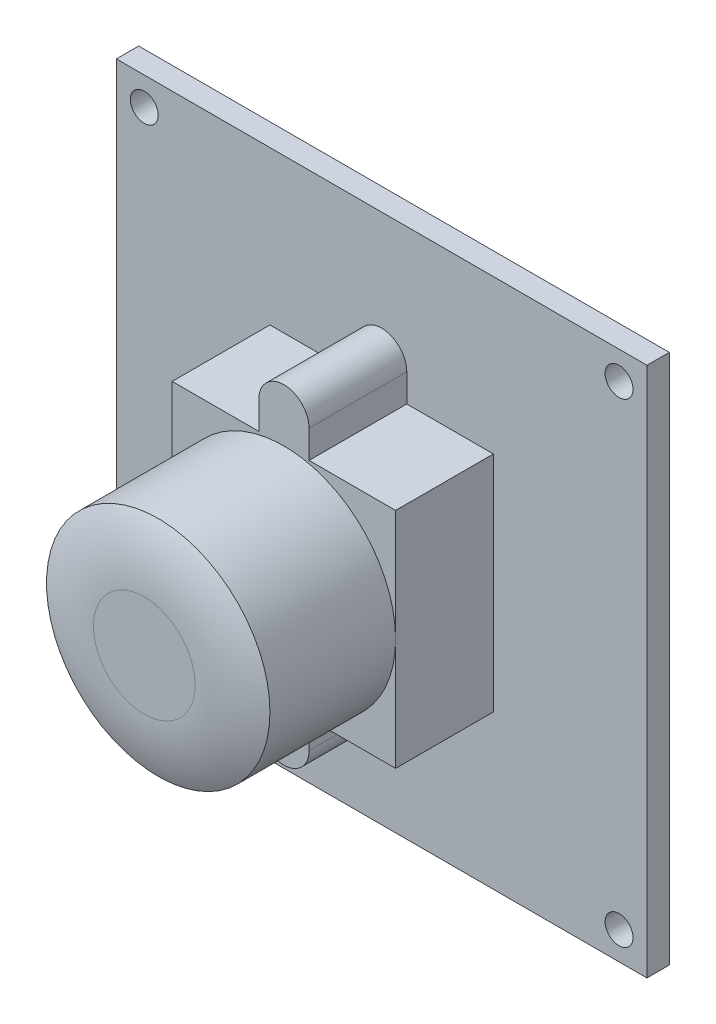
ISO-10303-21;
HEADER;
FILE_DESCRIPTION(('STEP AP214'),'2;1');
FILE_NAME('part.step','',(''),(''),'','','');
FILE_SCHEMA(('AUTOMOTIVE_DESIGN { 1 0 10303 214 1 1 1 1 }'));
ENDSEC;
DATA;
#1=APPLICATION_CONTEXT('core data for automotive mechanical design processes');
#2=APPLICATION_PROTOCOL_DEFINITION('international standard','automotive_design',2000,#1);
#3=PRODUCT_CONTEXT('',#1,'mechanical');
#4=PRODUCT('Part','Part','',(#3));
#5=PRODUCT_RELATED_PRODUCT_CATEGORY('part','',(#4));
#6=PRODUCT_DEFINITION_FORMATION('','',#4);
#7=PRODUCT_DEFINITION_CONTEXT('part definition',#1,'design');
#8=PRODUCT_DEFINITION('design','',#6,#7);
#9=PRODUCT_DEFINITION_SHAPE('','',#8);
#10=(LENGTH_UNIT() NAMED_UNIT(*) SI_UNIT(.MILLI.,.METRE.));
#11=(NAMED_UNIT(*) PLANE_ANGLE_UNIT() SI_UNIT($,.RADIAN.));
#12=(NAMED_UNIT(*) SI_UNIT($,.STERADIAN.) SOLID_ANGLE_UNIT());
#13=UNCERTAINTY_MEASURE_WITH_UNIT(LENGTH_MEASURE(1.E-05),#10,'distance_accuracy_value','');
#14=(GEOMETRIC_REPRESENTATION_CONTEXT(3) GLOBAL_UNCERTAINTY_ASSIGNED_CONTEXT((#13)) GLOBAL_UNIT_ASSIGNED_CONTEXT((#10,
#11,#12)) REPRESENTATION_CONTEXT('',''));
#15=CARTESIAN_POINT('',(0.,0.,0.));
#16=DIRECTION('',(0.,0.,1.));
#17=DIRECTION('',(1.,0.,0.));
#18=AXIS2_PLACEMENT_3D('',#15,#16,#17);
#19=CARTESIAN_POINT('',(19.,9.,8.6));
#20=DIRECTION('',(0.,0.,1.));
#21=DIRECTION('',(1.,0.,0.));
#22=AXIS2_PLACEMENT_3D('',#19,#20,#21);
#23=PLANE('',#22);
#24=CARTESIAN_POINT('',(19.,19.,8.6));
#25=DIRECTION('',(0.,0.,1.));
#26=DIRECTION('',(1.,0.,0.));
#27=AXIS2_PLACEMENT_3D('',#24,#25,#26);
#28=CIRCLE('',#27,8.);
#29=CARTESIAN_POINT('',(27.,19.,8.6));
#30=VERTEX_POINT('',#29);
#31=CARTESIAN_POINT('',(11.,19.,8.6));
#32=VERTEX_POINT('',#31);
#33=EDGE_CURVE('E199',#30,#32,#28,.T.);
#34=ORIENTED_EDGE('',*,*,#33,.F.);
#35=DIRECTION('',(0.,1.,0.));
#36=VECTOR('',#35,1.);
#37=CARTESIAN_POINT('',(27.,27.,8.6));
#38=LINE('',#37,#36);
#39=CARTESIAN_POINT('',(27.,27.,8.6));
#40=VERTEX_POINT('',#39);
#41=EDGE_CURVE('E223',#30,#40,#38,.T.);
#42=ORIENTED_EDGE('',*,*,#41,.T.);
#43=DIRECTION('',(-1.,0.,0.));
#44=VECTOR('',#43,1.);
#45=CARTESIAN_POINT('',(20.8,27.,8.6));
#46=LINE('',#45,#44);
#47=CARTESIAN_POINT('',(20.8,27.,8.6));
#48=VERTEX_POINT('',#47);
#49=EDGE_CURVE('E226',#40,#48,#46,.T.);
#50=ORIENTED_EDGE('',*,*,#49,.T.);
#51=DIRECTION('',(0.,1.,0.));
#52=VECTOR('',#51,1.);
#53=CARTESIAN_POINT('',(20.8,29.,8.6));
#54=LINE('',#53,#52);
#55=CARTESIAN_POINT('',(20.8,29.,8.6));
#56=VERTEX_POINT('',#55);
#57=EDGE_CURVE('E228',#48,#56,#54,.T.);
#58=ORIENTED_EDGE('',*,*,#57,.T.);
#59=CARTESIAN_POINT('',(19.,29.,8.6));
#60=DIRECTION('',(0.,0.,1.));
#61=DIRECTION('',(-1.,0.,0.));
#62=AXIS2_PLACEMENT_3D('',#59,#60,#61);
#63=CIRCLE('',#62,1.79999999999999);
#64=CARTESIAN_POINT('',(17.2,29.,8.6));
#65=VERTEX_POINT('',#64);
#66=EDGE_CURVE('E230',#56,#65,#63,.T.);
#67=ORIENTED_EDGE('',*,*,#66,.T.);
#68=DIRECTION('',(0.,-1.,0.));
#69=VECTOR('',#68,1.);
#70=CARTESIAN_POINT('',(17.2,27.,8.6));
#71=LINE('',#70,#69);
#72=CARTESIAN_POINT('',(17.2,27.,8.6));
#73=VERTEX_POINT('',#72);
#74=EDGE_CURVE('E232',#65,#73,#71,.T.);
#75=ORIENTED_EDGE('',*,*,#74,.T.);
#76=DIRECTION('',(-1.,0.,0.));
#77=VECTOR('',#76,1.);
#78=CARTESIAN_POINT('',(11.,27.,8.6));
#79=LINE('',#78,#77);
#80=CARTESIAN_POINT('',(11.,27.,8.6));
#81=VERTEX_POINT('',#80);
#82=EDGE_CURVE('E234',#73,#81,#79,.T.);
#83=ORIENTED_EDGE('',*,*,#82,.T.);
#84=DIRECTION('',(0.,-1.,0.));
#85=VECTOR('',#84,1.);
#86=CARTESIAN_POINT('',(11.,27.,8.6));
#87=LINE('',#86,#85);
#88=EDGE_CURVE('E209',#81,#32,#87,.T.);
#89=ORIENTED_EDGE('',*,*,#88,.T.);
#90=EDGE_LOOP('',(#34,#42,#50,#58,#67,#75,#83,#89));
#91=FACE_BOUND('',#90,.T.);
#92=ADVANCED_FACE('F32',(#91),#23,.T.);
#93=CARTESIAN_POINT('',(0.,0.,1.6));
#94=DIRECTION('',(0.,0.,-1.));
#95=DIRECTION('',(-1.,0.,0.));
#96=AXIS2_PLACEMENT_3D('',#93,#94,#95);
#97=PLANE('',#96);
#98=CARTESIAN_POINT('',(36.,36.,1.6));
#99=DIRECTION('',(0.,0.,1.));
#100=DIRECTION('',(-1.,0.,0.));
#101=AXIS2_PLACEMENT_3D('',#98,#99,#100);
#102=CIRCLE('',#101,1.00000000000001);
#103=CARTESIAN_POINT('',(35.,36.,1.6));
#104=VERTEX_POINT('',#103);
#105=EDGE_CURVE('E308',#104,#104,#102,.T.);
#106=ORIENTED_EDGE('',*,*,#105,.F.);
#107=EDGE_LOOP('',(#106));
#108=FACE_BOUND('',#107,.T.);
#109=CARTESIAN_POINT('',(36.,2.,1.6));
#110=DIRECTION('',(0.,0.,1.));
#111=DIRECTION('',(-1.,0.,0.));
#112=AXIS2_PLACEMENT_3D('',#109,#110,#111);
#113=CIRCLE('',#112,1.);
#114=CARTESIAN_POINT('',(35.,2.,1.6));
#115=VERTEX_POINT('',#114);
#116=EDGE_CURVE('E314',#115,#115,#113,.T.);
#117=ORIENTED_EDGE('',*,*,#116,.F.);
#118=EDGE_LOOP('',(#117));
#119=FACE_BOUND('',#118,.T.);
#120=CARTESIAN_POINT('',(2.,2.,1.6));
#121=DIRECTION('',(0.,0.,1.));
#122=DIRECTION('',(1.,0.,0.));
#123=AXIS2_PLACEMENT_3D('',#120,#121,#122);
#124=CIRCLE('',#123,1.);
#125=CARTESIAN_POINT('',(3.,2.,1.6));
#126=VERTEX_POINT('',#125);
#127=EDGE_CURVE('E320',#126,#126,#124,.T.);
#128=ORIENTED_EDGE('',*,*,#127,.F.);
#129=EDGE_LOOP('',(#128));
#130=FACE_BOUND('',#129,.T.);
#131=CARTESIAN_POINT('',(2.,36.,1.6));
#132=DIRECTION('',(0.,0.,1.));
#133=DIRECTION('',(1.,0.,0.));
#134=AXIS2_PLACEMENT_3D('',#131,#132,#133);
#135=CIRCLE('',#134,1.);
#136=CARTESIAN_POINT('',(3.,36.,1.6));
#137=VERTEX_POINT('',#136);
#138=EDGE_CURVE('E326',#137,#137,#135,.T.);
#139=ORIENTED_EDGE('',*,*,#138,.F.);
#140=EDGE_LOOP('',(#139));
#141=FACE_BOUND('',#140,.T.);
#142=DIRECTION('',(0.,-1.,0.));
#143=VECTOR('',#142,1.);
#144=CARTESIAN_POINT('',(0.,0.,1.6));
#145=LINE('',#144,#143);
#146=CARTESIAN_POINT('',(0.,38.,1.6));
#147=VERTEX_POINT('',#146);
#148=CARTESIAN_POINT('',(0.,0.,1.6));
#149=VERTEX_POINT('',#148);
#150=EDGE_CURVE('E331',#147,#149,#145,.T.);
#151=ORIENTED_EDGE('',*,*,#150,.T.);
#152=DIRECTION('',(1.,0.,0.));
#153=VECTOR('',#152,1.);
#154=CARTESIAN_POINT('',(0.,0.,1.6));
#155=LINE('',#154,#153);
#156=CARTESIAN_POINT('',(38.,0.,1.6));
#157=VERTEX_POINT('',#156);
#158=EDGE_CURVE('E334',#149,#157,#155,.T.);
#159=ORIENTED_EDGE('',*,*,#158,.T.);
#160=DIRECTION('',(0.,1.,0.));
#161=VECTOR('',#160,1.);
#162=CARTESIAN_POINT('',(38.,0.,1.6));
#163=LINE('',#162,#161);
#164=CARTESIAN_POINT('',(38.,38.,1.6));
#165=VERTEX_POINT('',#164);
#166=EDGE_CURVE('E337',#157,#165,#163,.T.);
#167=ORIENTED_EDGE('',*,*,#166,.T.);
#168=DIRECTION('',(-1.,0.,0.));
#169=VECTOR('',#168,1.);
#170=CARTESIAN_POINT('',(0.,38.,1.6));
#171=LINE('',#170,#169);
#172=EDGE_CURVE('E339',#165,#147,#171,.T.);
#173=ORIENTED_EDGE('',*,*,#172,.T.);
#174=EDGE_LOOP('',(#151,#159,#167,#173));
#175=FACE_BOUND('',#174,.T.);
#176=DIRECTION('',(0.,-1.,0.));
#177=VECTOR('',#176,1.);
#178=CARTESIAN_POINT('',(11.,27.,1.6));
#179=LINE('',#178,#177);
#180=CARTESIAN_POINT('',(11.,27.,1.6));
#181=VERTEX_POINT('',#180);
#182=CARTESIAN_POINT('',(11.,11.,1.6));
#183=VERTEX_POINT('',#182);
#184=EDGE_CURVE('E202',#181,#183,#179,.T.);
#185=ORIENTED_EDGE('',*,*,#184,.F.);
#186=DIRECTION('',(-1.,0.,0.));
#187=VECTOR('',#186,1.);
#188=CARTESIAN_POINT('',(11.,27.,1.6));
#189=LINE('',#188,#187);
#190=CARTESIAN_POINT('',(17.2,27.,1.6));
#191=VERTEX_POINT('',#190);
#192=EDGE_CURVE('E269',#191,#181,#189,.T.);
#193=ORIENTED_EDGE('',*,*,#192,.F.);
#194=DIRECTION('',(0.,-1.,0.));
#195=VECTOR('',#194,1.);
#196=CARTESIAN_POINT('',(17.2,27.,1.6));
#197=LINE('',#196,#195);
#198=CARTESIAN_POINT('',(17.2,29.,1.6));
#199=VERTEX_POINT('',#198);
#200=EDGE_CURVE('E266',#199,#191,#197,.T.);
#201=ORIENTED_EDGE('',*,*,#200,.F.);
#202=CARTESIAN_POINT('',(19.,29.,1.6));
#203=DIRECTION('',(0.,0.,1.));
#204=DIRECTION('',(-1.,0.,0.));
#205=AXIS2_PLACEMENT_3D('',#202,#203,#204);
#206=CIRCLE('',#205,1.79999999999999);
#207=CARTESIAN_POINT('',(20.8,29.,1.6));
#208=VERTEX_POINT('',#207);
#209=EDGE_CURVE('E263',#208,#199,#206,.T.);
#210=ORIENTED_EDGE('',*,*,#209,.F.);
#211=DIRECTION('',(0.,1.,0.));
#212=VECTOR('',#211,1.);
#213=CARTESIAN_POINT('',(20.8,29.,1.6));
#214=LINE('',#213,#212);
#215=CARTESIAN_POINT('',(20.8,27.,1.6));
#216=VERTEX_POINT('',#215);
#217=EDGE_CURVE('E260',#216,#208,#214,.T.);
#218=ORIENTED_EDGE('',*,*,#217,.F.);
#219=DIRECTION('',(-1.,0.,0.));
#220=VECTOR('',#219,1.);
#221=CARTESIAN_POINT('',(20.8,27.,1.6));
#222=LINE('',#221,#220);
#223=CARTESIAN_POINT('',(27.,27.,1.6));
#224=VERTEX_POINT('',#223);
#225=EDGE_CURVE('E257',#224,#216,#222,.T.);
#226=ORIENTED_EDGE('',*,*,#225,.F.);
#227=DIRECTION('',(0.,1.,0.));
#228=VECTOR('',#227,1.);
#229=CARTESIAN_POINT('',(27.,27.,1.6));
#230=LINE('',#229,#228);
#231=CARTESIAN_POINT('',(27.,11.,1.6));
#232=VERTEX_POINT('',#231);
#233=EDGE_CURVE('E254',#232,#224,#230,.T.);
#234=ORIENTED_EDGE('',*,*,#233,.F.);
#235=DIRECTION('',(1.,0.,0.));
#236=VECTOR('',#235,1.);
#237=CARTESIAN_POINT('',(20.8,11.,1.6));
#238=LINE('',#237,#236);
#239=CARTESIAN_POINT('',(20.8,11.,1.6));
#240=VERTEX_POINT('',#239);
#241=EDGE_CURVE('E251',#240,#232,#238,.T.);
#242=ORIENTED_EDGE('',*,*,#241,.F.);
#243=DIRECTION('',(0.,1.,0.));
#244=VECTOR('',#243,1.);
#245=CARTESIAN_POINT('',(20.8,9.,1.6));
#246=LINE('',#245,#244);
#247=CARTESIAN_POINT('',(20.8,9.,1.6));
#248=VERTEX_POINT('',#247);
#249=EDGE_CURVE('E248',#248,#240,#246,.T.);
#250=ORIENTED_EDGE('',*,*,#249,.F.);
#251=CARTESIAN_POINT('',(19.,9.,1.6));
#252=DIRECTION('',(0.,0.,1.));
#253=DIRECTION('',(1.,0.,0.));
#254=AXIS2_PLACEMENT_3D('',#251,#252,#253);
#255=CIRCLE('',#254,1.79999999999999);
#256=CARTESIAN_POINT('',(17.2,9.,1.6));
#257=VERTEX_POINT('',#256);
#258=EDGE_CURVE('E245',#257,#248,#255,.T.);
#259=ORIENTED_EDGE('',*,*,#258,.F.);
#260=DIRECTION('',(0.,-1.,0.));
#261=VECTOR('',#260,1.);
#262=CARTESIAN_POINT('',(17.2,11.,1.6));
#263=LINE('',#262,#261);
#264=CARTESIAN_POINT('',(17.2,11.,1.6));
#265=VERTEX_POINT('',#264);
#266=EDGE_CURVE('E242',#265,#257,#263,.T.);
#267=ORIENTED_EDGE('',*,*,#266,.F.);
#268=DIRECTION('',(1.,0.,0.));
#269=VECTOR('',#268,1.);
#270=CARTESIAN_POINT('',(11.,11.,1.6));
#271=LINE('',#270,#269);
#272=EDGE_CURVE('E239',#183,#265,#271,.T.);
#273=ORIENTED_EDGE('',*,*,#272,.F.);
#274=EDGE_LOOP('',(#185,#193,#201,#210,#218,#226,#234,#242,#250,#259,#267,#273));
#275=FACE_BOUND('',#274,.T.);
#276=ADVANCED_FACE('F382',(#108,#119,#130,#141,#175,#275),#97,.F.);
#277=CARTESIAN_POINT('',(0.,0.,0.));
#278=DIRECTION('',(0.,0.,-1.));
#279=DIRECTION('',(-1.,0.,0.));
#280=AXIS2_PLACEMENT_3D('',#277,#278,#279);
#281=PLANE('',#280);
#282=DIRECTION('',(-1.,0.,0.));
#283=VECTOR('',#282,1.);
#284=CARTESIAN_POINT('',(0.,11.,0.));
#285=LINE('',#284,#283);
#286=CARTESIAN_POINT('',(6.,11.,0.));
#287=VERTEX_POINT('',#286);
#288=CARTESIAN_POINT('',(0.,11.,0.));
#289=VERTEX_POINT('',#288);
#290=EDGE_CURVE('E47',#287,#289,#285,.T.);
#291=ORIENTED_EDGE('',*,*,#290,.F.);
#292=DIRECTION('',(0.,-1.,0.));
#293=VECTOR('',#292,1.);
#294=CARTESIAN_POINT('',(6.,11.,0.));
#295=LINE('',#294,#293);
#296=CARTESIAN_POINT('',(6.,21.,0.));
#297=VERTEX_POINT('',#296);
#298=EDGE_CURVE('E718',#297,#287,#295,.T.);
#299=ORIENTED_EDGE('',*,*,#298,.F.);
#300=DIRECTION('',(1.,0.,0.));
#301=VECTOR('',#300,1.);
#302=CARTESIAN_POINT('',(0.,21.,0.));
#303=LINE('',#302,#301);
#304=CARTESIAN_POINT('',(0.,21.,0.));
#305=VERTEX_POINT('',#304);
#306=EDGE_CURVE('E720',#305,#297,#303,.T.);
#307=ORIENTED_EDGE('',*,*,#306,.F.);
#308=DIRECTION('',(0.,-1.,0.));
#309=VECTOR('',#308,1.);
#310=CARTESIAN_POINT('',(0.,0.,0.));
#311=LINE('',#310,#309);
#312=CARTESIAN_POINT('',(0.,38.,0.));
#313=VERTEX_POINT('',#312);
#314=EDGE_CURVE('E198',#313,#305,#311,.T.);
#315=ORIENTED_EDGE('',*,*,#314,.F.);
#316=DIRECTION('',(-1.,0.,0.));
#317=VECTOR('',#316,1.);
#318=CARTESIAN_POINT('',(0.,38.,0.));
#319=LINE('',#318,#317);
#320=CARTESIAN_POINT('',(38.,38.,0.));
#321=VERTEX_POINT('',#320);
#322=EDGE_CURVE('E335',#321,#313,#319,.T.);
#323=ORIENTED_EDGE('',*,*,#322,.F.);
#324=DIRECTION('',(0.,1.,0.));
#325=VECTOR('',#324,1.);
#326=CARTESIAN_POINT('',(38.,0.,0.));
#327=LINE('',#326,#325);
#328=CARTESIAN_POINT('',(38.,0.,0.));
#329=VERTEX_POINT('',#328);
#330=EDGE_CURVE('E345',#329,#321,#327,.T.);
#331=ORIENTED_EDGE('',*,*,#330,.F.);
#332=DIRECTION('',(1.,0.,0.));
#333=VECTOR('',#332,1.);
#334=CARTESIAN_POINT('',(0.,0.,0.));
#335=LINE('',#334,#333);
#336=CARTESIAN_POINT('',(0.,0.,0.));
#337=VERTEX_POINT('',#336);
#338=EDGE_CURVE('E343',#337,#329,#335,.T.);
#339=ORIENTED_EDGE('',*,*,#338,.F.);
#340=EDGE_CURVE('E52',#289,#337,#311,.T.);
#341=ORIENTED_EDGE('',*,*,#340,.F.);
#342=EDGE_LOOP('',(#291,#299,#307,#315,#323,#331,#339,#341));
#343=FACE_BOUND('',#342,.T.);
#344=CARTESIAN_POINT('',(36.,2.,0.));
#345=DIRECTION('',(0.,0.,1.));
#346=DIRECTION('',(-1.,0.,0.));
#347=AXIS2_PLACEMENT_3D('',#344,#345,#346);
#348=CIRCLE('',#347,1.);
#349=CARTESIAN_POINT('',(35.,2.,0.));
#350=VERTEX_POINT('',#349);
#351=EDGE_CURVE('E311',#350,#350,#348,.T.);
#352=ORIENTED_EDGE('',*,*,#351,.T.);
#353=EDGE_LOOP('',(#352));
#354=FACE_BOUND('',#353,.T.);
#355=CARTESIAN_POINT('',(2.,36.,0.));
#356=DIRECTION('',(0.,0.,1.));
#357=DIRECTION('',(1.,0.,0.));
#358=AXIS2_PLACEMENT_3D('',#355,#356,#357);
#359=CIRCLE('',#358,1.);
#360=CARTESIAN_POINT('',(3.,36.,0.));
#361=VERTEX_POINT('',#360);
#362=EDGE_CURVE('E323',#361,#361,#359,.T.);
#363=ORIENTED_EDGE('',*,*,#362,.T.);
#364=EDGE_LOOP('',(#363));
#365=FACE_BOUND('',#364,.T.);
#366=CARTESIAN_POINT('',(2.,2.,0.));
#367=DIRECTION('',(0.,0.,1.));
#368=DIRECTION('',(1.,0.,0.));
#369=AXIS2_PLACEMENT_3D('',#366,#367,#368);
#370=CIRCLE('',#369,1.);
#371=CARTESIAN_POINT('',(3.,2.,0.));
#372=VERTEX_POINT('',#371);
#373=EDGE_CURVE('E317',#372,#372,#370,.T.);
#374=ORIENTED_EDGE('',*,*,#373,.T.);
#375=EDGE_LOOP('',(#374));
#376=FACE_BOUND('',#375,.T.);
#377=CARTESIAN_POINT('',(36.,36.,0.));
#378=DIRECTION('',(0.,0.,1.));
#379=DIRECTION('',(-1.,0.,0.));
#380=AXIS2_PLACEMENT_3D('',#377,#378,#379);
#381=CIRCLE('',#380,1.00000000000001);
#382=CARTESIAN_POINT('',(35.,36.,0.));
#383=VERTEX_POINT('',#382);
#384=EDGE_CURVE('E307',#383,#383,#381,.T.);
#385=ORIENTED_EDGE('',*,*,#384,.T.);
#386=EDGE_LOOP('',(#385));
#387=FACE_BOUND('',#386,.T.);
#388=ADVANCED_FACE('F432',(#343,#354,#365,#376,#387),#281,.T.);
#389=CARTESIAN_POINT('',(0.,0.,1.6));
#390=DIRECTION('',(1.,0.,0.));
#391=DIRECTION('',(0.,0.,-1.));
#392=AXIS2_PLACEMENT_3D('',#389,#390,#391);
#393=PLANE('',#392);
#394=ORIENTED_EDGE('',*,*,#314,.T.);
#395=DIRECTION('',(0.,0.,1.));
#396=VECTOR('',#395,1.);
#397=CARTESIAN_POINT('',(0.,21.,-14.));
#398=LINE('',#397,#396);
#399=CARTESIAN_POINT('',(0.,21.,-14.));
#400=VERTEX_POINT('',#399);
#401=EDGE_CURVE('E178',#400,#305,#398,.T.);
#402=ORIENTED_EDGE('',*,*,#401,.F.);
#403=DIRECTION('',(0.,1.,0.));
#404=VECTOR('',#403,1.);
#405=CARTESIAN_POINT('',(0.,11.,-14.));
#406=LINE('',#405,#404);
#407=CARTESIAN_POINT('',(0.,11.,-14.));
#408=VERTEX_POINT('',#407);
#409=EDGE_CURVE('E184',#408,#400,#406,.T.);
#410=ORIENTED_EDGE('',*,*,#409,.F.);
#411=DIRECTION('',(0.,0.,1.));
#412=VECTOR('',#411,1.);
#413=CARTESIAN_POINT('',(0.,11.,-14.));
#414=LINE('',#413,#412);
#415=EDGE_CURVE('E712',#408,#289,#414,.T.);
#416=ORIENTED_EDGE('',*,*,#415,.T.);
#417=ORIENTED_EDGE('',*,*,#340,.T.);
#418=DIRECTION('',(0.,0.,-1.));
#419=VECTOR('',#418,1.);
#420=CARTESIAN_POINT('',(0.,0.,1.6));
#421=LINE('',#420,#419);
#422=EDGE_CURVE('E355',#149,#337,#421,.T.);
#423=ORIENTED_EDGE('',*,*,#422,.F.);
#424=ORIENTED_EDGE('',*,*,#150,.F.);
#425=DIRECTION('',(0.,0.,-1.));
#426=VECTOR('',#425,1.);
#427=CARTESIAN_POINT('',(0.,38.,1.6));
#428=LINE('',#427,#426);
#429=EDGE_CURVE('E341',#147,#313,#428,.T.);
#430=ORIENTED_EDGE('',*,*,#429,.T.);
#431=EDGE_LOOP('',(#394,#402,#410,#416,#417,#423,#424,#430));
#432=FACE_BOUND('',#431,.T.);
#433=ADVANCED_FACE('F195',(#432),#393,.F.);
#434=CARTESIAN_POINT('',(0.,0.,1.6));
#435=DIRECTION('',(0.,1.,0.));
#436=DIRECTION('',(0.,0.,1.));
#437=AXIS2_PLACEMENT_3D('',#434,#435,#436);
#438=PLANE('',#437);
#439=ORIENTED_EDGE('',*,*,#338,.T.);
#440=DIRECTION('',(0.,0.,-1.));
#441=VECTOR('',#440,1.);
#442=CARTESIAN_POINT('',(38.,0.,1.6));
#443=LINE('',#442,#441);
#444=EDGE_CURVE('E352',#157,#329,#443,.T.);
#445=ORIENTED_EDGE('',*,*,#444,.F.);
#446=ORIENTED_EDGE('',*,*,#158,.F.);
#447=ORIENTED_EDGE('',*,*,#422,.T.);
#448=EDGE_LOOP('',(#439,#445,#446,#447));
#449=FACE_BOUND('',#448,.T.);
#450=ADVANCED_FACE('F651',(#449),#438,.F.);
#451=CARTESIAN_POINT('',(38.,0.,1.6));
#452=DIRECTION('',(-1.,0.,0.));
#453=DIRECTION('',(0.,0.,1.));
#454=AXIS2_PLACEMENT_3D('',#451,#452,#453);
#455=PLANE('',#454);
#456=ORIENTED_EDGE('',*,*,#330,.T.);
#457=DIRECTION('',(0.,0.,-1.));
#458=VECTOR('',#457,1.);
#459=CARTESIAN_POINT('',(38.,38.,1.6));
#460=LINE('',#459,#458);
#461=EDGE_CURVE('E349',#165,#321,#460,.T.);
#462=ORIENTED_EDGE('',*,*,#461,.F.);
#463=ORIENTED_EDGE('',*,*,#166,.F.);
#464=ORIENTED_EDGE('',*,*,#444,.T.);
#465=EDGE_LOOP('',(#456,#462,#463,#464));
#466=FACE_BOUND('',#465,.T.);
#467=ADVANCED_FACE('F641',(#466),#455,.F.);
#468=CARTESIAN_POINT('',(0.,38.,1.6));
#469=DIRECTION('',(0.,-1.,0.));
#470=DIRECTION('',(0.,0.,-1.));
#471=AXIS2_PLACEMENT_3D('',#468,#469,#470);
#472=PLANE('',#471);
#473=ORIENTED_EDGE('',*,*,#322,.T.);
#474=ORIENTED_EDGE('',*,*,#429,.F.);
#475=ORIENTED_EDGE('',*,*,#172,.F.);
#476=ORIENTED_EDGE('',*,*,#461,.T.);
#477=EDGE_LOOP('',(#473,#474,#475,#476));
#478=FACE_BOUND('',#477,.T.);
#479=ADVANCED_FACE('F631',(#478),#472,.F.);
#480=CARTESIAN_POINT('',(2.,36.,1.6));
#481=DIRECTION('',(0.,0.,-1.));
#482=DIRECTION('',(-1.,0.,0.));
#483=AXIS2_PLACEMENT_3D('',#480,#481,#482);
#484=CYLINDRICAL_SURFACE('',#483,1.);
#485=ORIENTED_EDGE('',*,*,#138,.T.);
#486=EDGE_LOOP('',(#485));
#487=FACE_BOUND('',#486,.T.);
#488=ORIENTED_EDGE('',*,*,#362,.F.);
#489=EDGE_LOOP('',(#488));
#490=FACE_BOUND('',#489,.T.);
#491=ADVANCED_FACE('F621',(#487,#490),#484,.F.);
#492=CARTESIAN_POINT('',(2.,2.,1.6));
#493=DIRECTION('',(0.,0.,-1.));
#494=DIRECTION('',(-1.,0.,0.));
#495=AXIS2_PLACEMENT_3D('',#492,#493,#494);
#496=CYLINDRICAL_SURFACE('',#495,1.);
#497=ORIENTED_EDGE('',*,*,#127,.T.);
#498=EDGE_LOOP('',(#497));
#499=FACE_BOUND('',#498,.T.);
#500=ORIENTED_EDGE('',*,*,#373,.F.);
#501=EDGE_LOOP('',(#500));
#502=FACE_BOUND('',#501,.T.);
#503=ADVANCED_FACE('F611',(#499,#502),#496,.F.);
#504=CARTESIAN_POINT('',(36.,2.,1.6));
#505=DIRECTION('',(0.,0.,-1.));
#506=DIRECTION('',(-1.,0.,0.));
#507=AXIS2_PLACEMENT_3D('',#504,#505,#506);
#508=CYLINDRICAL_SURFACE('',#507,1.);
#509=ORIENTED_EDGE('',*,*,#116,.T.);
#510=EDGE_LOOP('',(#509));
#511=FACE_BOUND('',#510,.T.);
#512=ORIENTED_EDGE('',*,*,#351,.F.);
#513=EDGE_LOOP('',(#512));
#514=FACE_BOUND('',#513,.T.);
#515=ADVANCED_FACE('F601',(#511,#514),#508,.F.);
#516=CARTESIAN_POINT('',(36.,36.,1.6));
#517=DIRECTION('',(0.,0.,-1.));
#518=DIRECTION('',(-1.,0.,0.));
#519=AXIS2_PLACEMENT_3D('',#516,#517,#518);
#520=CYLINDRICAL_SURFACE('',#519,1.00000000000001);
#521=ORIENTED_EDGE('',*,*,#105,.T.);
#522=EDGE_LOOP('',(#521));
#523=FACE_BOUND('',#522,.T.);
#524=ORIENTED_EDGE('',*,*,#384,.F.);
#525=EDGE_LOOP('',(#524));
#526=FACE_BOUND('',#525,.T.);
#527=ADVANCED_FACE('F514',(#523,#526),#520,.F.);
#528=CARTESIAN_POINT('',(11.,27.,8.6));
#529=DIRECTION('',(1.,0.,0.));
#530=DIRECTION('',(0.,1.,0.));
#531=AXIS2_PLACEMENT_3D('',#528,#529,#530);
#532=PLANE('',#531);
#533=ORIENTED_EDGE('',*,*,#184,.T.);
#534=DIRECTION('',(0.,0.,-1.));
#535=VECTOR('',#534,1.);
#536=CARTESIAN_POINT('',(11.,11.,8.6));
#537=LINE('',#536,#535);
#538=CARTESIAN_POINT('',(11.,11.,8.6));
#539=VERTEX_POINT('',#538);
#540=EDGE_CURVE('E304',#539,#183,#537,.T.);
#541=ORIENTED_EDGE('',*,*,#540,.F.);
#542=EDGE_CURVE('E213',#32,#539,#87,.T.);
#543=ORIENTED_EDGE('',*,*,#542,.F.);
#544=ORIENTED_EDGE('',*,*,#88,.F.);
#545=DIRECTION('',(0.,0.,-1.));
#546=VECTOR('',#545,1.);
#547=CARTESIAN_POINT('',(11.,27.,8.6));
#548=LINE('',#547,#546);
#549=EDGE_CURVE('E236',#81,#181,#548,.T.);
#550=ORIENTED_EDGE('',*,*,#549,.T.);
#551=EDGE_LOOP('',(#533,#541,#543,#544,#550));
#552=FACE_BOUND('',#551,.T.);
#553=ADVANCED_FACE('F373',(#552),#532,.F.);
#554=CARTESIAN_POINT('',(11.,11.,8.6));
#555=DIRECTION('',(0.,1.,0.));
#556=DIRECTION('',(0.,0.,1.));
#557=AXIS2_PLACEMENT_3D('',#554,#555,#556);
#558=PLANE('',#557);
#559=ORIENTED_EDGE('',*,*,#272,.T.);
#560=DIRECTION('',(0.,0.,-1.));
#561=VECTOR('',#560,1.);
#562=CARTESIAN_POINT('',(17.2,11.,8.6));
#563=LINE('',#562,#561);
#564=CARTESIAN_POINT('',(17.2,11.,8.6));
#565=VERTEX_POINT('',#564);
#566=EDGE_CURVE('E301',#565,#265,#563,.T.);
#567=ORIENTED_EDGE('',*,*,#566,.F.);
#568=DIRECTION('',(1.,0.,0.));
#569=VECTOR('',#568,1.);
#570=CARTESIAN_POINT('',(11.,11.,8.6));
#571=LINE('',#570,#569);
#572=EDGE_CURVE('E212',#539,#565,#571,.T.);
#573=ORIENTED_EDGE('',*,*,#572,.F.);
#574=ORIENTED_EDGE('',*,*,#540,.T.);
#575=EDGE_LOOP('',(#559,#567,#573,#574));
#576=FACE_BOUND('',#575,.T.);
#577=ADVANCED_FACE('F385',(#576),#558,.F.);
#578=CARTESIAN_POINT('',(17.2,11.,8.6));
#579=DIRECTION('',(1.,0.,0.));
#580=DIRECTION('',(0.,1.,0.));
#581=AXIS2_PLACEMENT_3D('',#578,#579,#580);
#582=PLANE('',#581);
#583=ORIENTED_EDGE('',*,*,#266,.T.);
#584=DIRECTION('',(0.,0.,-1.));
#585=VECTOR('',#584,1.);
#586=CARTESIAN_POINT('',(17.2,9.,8.6));
#587=LINE('',#586,#585);
#588=CARTESIAN_POINT('',(17.2,9.,8.6));
#589=VERTEX_POINT('',#588);
#590=EDGE_CURVE('E298',#589,#257,#587,.T.);
#591=ORIENTED_EDGE('',*,*,#590,.F.);
#592=DIRECTION('',(0.,-1.,0.));
#593=VECTOR('',#592,1.);
#594=CARTESIAN_POINT('',(17.2,11.,8.6));
#595=LINE('',#594,#593);
#596=EDGE_CURVE('E215',#565,#589,#595,.T.);
#597=ORIENTED_EDGE('',*,*,#596,.F.);
#598=ORIENTED_EDGE('',*,*,#566,.T.);
#599=EDGE_LOOP('',(#583,#591,#597,#598));
#600=FACE_BOUND('',#599,.T.);
#601=ADVANCED_FACE('F391',(#600),#582,.F.);
#602=CARTESIAN_POINT('',(19.,9.,8.6));
#603=DIRECTION('',(0.,0.,-1.));
#604=DIRECTION('',(-1.,0.,0.));
#605=AXIS2_PLACEMENT_3D('',#602,#603,#604);
#606=CYLINDRICAL_SURFACE('',#605,1.79999999999999);
#607=ORIENTED_EDGE('',*,*,#258,.T.);
#608=DIRECTION('',(0.,0.,-1.));
#609=VECTOR('',#608,1.);
#610=CARTESIAN_POINT('',(20.8,9.,8.6));
#611=LINE('',#610,#609);
#612=CARTESIAN_POINT('',(20.8,9.,8.6));
#613=VERTEX_POINT('',#612);
#614=EDGE_CURVE('E295',#613,#248,#611,.T.);
#615=ORIENTED_EDGE('',*,*,#614,.F.);
#616=CARTESIAN_POINT('',(19.,9.,8.6));
#617=DIRECTION('',(0.,0.,1.));
#618=DIRECTION('',(1.,0.,0.));
#619=AXIS2_PLACEMENT_3D('',#616,#617,#618);
#620=CIRCLE('',#619,1.79999999999999);
#621=EDGE_CURVE('E217',#589,#613,#620,.T.);
#622=ORIENTED_EDGE('',*,*,#621,.F.);
#623=ORIENTED_EDGE('',*,*,#590,.T.);
#624=EDGE_LOOP('',(#607,#615,#622,#623));
#625=FACE_BOUND('',#624,.T.);
#626=ADVANCED_FACE('F393',(#625),#606,.T.);
#627=CARTESIAN_POINT('',(20.8,9.,8.6));
#628=DIRECTION('',(-1.,0.,0.));
#629=DIRECTION('',(0.,-1.,0.));
#630=AXIS2_PLACEMENT_3D('',#627,#628,#629);
#631=PLANE('',#630);
#632=ORIENTED_EDGE('',*,*,#249,.T.);
#633=DIRECTION('',(0.,0.,-1.));
#634=VECTOR('',#633,1.);
#635=CARTESIAN_POINT('',(20.8,11.,8.6));
#636=LINE('',#635,#634);
#637=CARTESIAN_POINT('',(20.8,11.,8.6));
#638=VERTEX_POINT('',#637);
#639=EDGE_CURVE('E292',#638,#240,#636,.T.);
#640=ORIENTED_EDGE('',*,*,#639,.F.);
#641=DIRECTION('',(0.,1.,0.));
#642=VECTOR('',#641,1.);
#643=CARTESIAN_POINT('',(20.8,9.,8.6));
#644=LINE('',#643,#642);
#645=EDGE_CURVE('E219',#613,#638,#644,.T.);
#646=ORIENTED_EDGE('',*,*,#645,.F.);
#647=ORIENTED_EDGE('',*,*,#614,.T.);
#648=EDGE_LOOP('',(#632,#640,#646,#647));
#649=FACE_BOUND('',#648,.T.);
#650=ADVANCED_FACE('F397',(#649),#631,.F.);
#651=CARTESIAN_POINT('',(20.8,11.,8.6));
#652=DIRECTION('',(0.,1.,0.));
#653=DIRECTION('',(-1.,0.,0.));
#654=AXIS2_PLACEMENT_3D('',#651,#652,#653);
#655=PLANE('',#654);
#656=ORIENTED_EDGE('',*,*,#241,.T.);
#657=DIRECTION('',(0.,0.,-1.));
#658=VECTOR('',#657,1.);
#659=CARTESIAN_POINT('',(27.,11.,8.6));
#660=LINE('',#659,#658);
#661=CARTESIAN_POINT('',(27.,11.,8.6));
#662=VERTEX_POINT('',#661);
#663=EDGE_CURVE('E289',#662,#232,#660,.T.);
#664=ORIENTED_EDGE('',*,*,#663,.F.);
#665=DIRECTION('',(1.,0.,0.));
#666=VECTOR('',#665,1.);
#667=CARTESIAN_POINT('',(20.8,11.,8.6));
#668=LINE('',#667,#666);
#669=EDGE_CURVE('E221',#638,#662,#668,.T.);
#670=ORIENTED_EDGE('',*,*,#669,.F.);
#671=ORIENTED_EDGE('',*,*,#639,.T.);
#672=EDGE_LOOP('',(#656,#664,#670,#671));
#673=FACE_BOUND('',#672,.T.);
#674=ADVANCED_FACE('F401',(#673),#655,.F.);
#675=CARTESIAN_POINT('',(27.,27.,8.6));
#676=DIRECTION('',(-1.,0.,0.));
#677=DIRECTION('',(0.,-1.,0.));
#678=AXIS2_PLACEMENT_3D('',#675,#676,#677);
#679=PLANE('',#678);
#680=ORIENTED_EDGE('',*,*,#233,.T.);
#681=DIRECTION('',(0.,0.,-1.));
#682=VECTOR('',#681,1.);
#683=CARTESIAN_POINT('',(27.,27.,8.6));
#684=LINE('',#683,#682);
#685=EDGE_CURVE('E286',#40,#224,#684,.T.);
#686=ORIENTED_EDGE('',*,*,#685,.F.);
#687=ORIENTED_EDGE('',*,*,#41,.F.);
#688=EDGE_CURVE('E224',#662,#30,#38,.T.);
#689=ORIENTED_EDGE('',*,*,#688,.F.);
#690=ORIENTED_EDGE('',*,*,#663,.T.);
#691=EDGE_LOOP('',(#680,#686,#687,#689,#690));
#692=FACE_BOUND('',#691,.T.);
#693=ADVANCED_FACE('F403',(#692),#679,.F.);
#694=CARTESIAN_POINT('',(20.8,27.,8.6));
#695=DIRECTION('',(0.,-1.,0.));
#696=DIRECTION('',(0.,0.,-1.));
#697=AXIS2_PLACEMENT_3D('',#694,#695,#696);
#698=PLANE('',#697);
#699=ORIENTED_EDGE('',*,*,#225,.T.);
#700=DIRECTION('',(0.,0.,-1.));
#701=VECTOR('',#700,1.);
#702=CARTESIAN_POINT('',(20.8,27.,8.6));
#703=LINE('',#702,#701);
#704=EDGE_CURVE('E283',#48,#216,#703,.T.);
#705=ORIENTED_EDGE('',*,*,#704,.F.);
#706=ORIENTED_EDGE('',*,*,#49,.F.);
#707=ORIENTED_EDGE('',*,*,#685,.T.);
#708=EDGE_LOOP('',(#699,#705,#706,#707));
#709=FACE_BOUND('',#708,.T.);
#710=ADVANCED_FACE('F410',(#709),#698,.F.);
#711=CARTESIAN_POINT('',(20.8,29.,8.6));
#712=DIRECTION('',(-1.,0.,0.));
#713=DIRECTION('',(0.,-1.,0.));
#714=AXIS2_PLACEMENT_3D('',#711,#712,#713);
#715=PLANE('',#714);
#716=ORIENTED_EDGE('',*,*,#217,.T.);
#717=DIRECTION('',(0.,0.,-1.));
#718=VECTOR('',#717,1.);
#719=CARTESIAN_POINT('',(20.8,29.,8.6));
#720=LINE('',#719,#718);
#721=EDGE_CURVE('E280',#56,#208,#720,.T.);
#722=ORIENTED_EDGE('',*,*,#721,.F.);
#723=ORIENTED_EDGE('',*,*,#57,.F.);
#724=ORIENTED_EDGE('',*,*,#704,.T.);
#725=EDGE_LOOP('',(#716,#722,#723,#724));
#726=FACE_BOUND('',#725,.T.);
#727=ADVANCED_FACE('F412',(#726),#715,.F.);
#728=CARTESIAN_POINT('',(19.,29.,8.6));
#729=DIRECTION('',(0.,0.,-1.));
#730=DIRECTION('',(-1.,0.,0.));
#731=AXIS2_PLACEMENT_3D('',#728,#729,#730);
#732=CYLINDRICAL_SURFACE('',#731,1.79999999999999);
#733=ORIENTED_EDGE('',*,*,#209,.T.);
#734=DIRECTION('',(0.,0.,-1.));
#735=VECTOR('',#734,1.);
#736=CARTESIAN_POINT('',(17.2,29.,8.6));
#737=LINE('',#736,#735);
#738=EDGE_CURVE('E277',#65,#199,#737,.T.);
#739=ORIENTED_EDGE('',*,*,#738,.F.);
#740=ORIENTED_EDGE('',*,*,#66,.F.);
#741=ORIENTED_EDGE('',*,*,#721,.T.);
#742=EDGE_LOOP('',(#733,#739,#740,#741));
#743=FACE_BOUND('',#742,.T.);
#744=ADVANCED_FACE('F416',(#743),#732,.T.);
#745=CARTESIAN_POINT('',(17.2,27.,8.6));
#746=DIRECTION('',(1.,0.,0.));
#747=DIRECTION('',(0.,1.,0.));
#748=AXIS2_PLACEMENT_3D('',#745,#746,#747);
#749=PLANE('',#748);
#750=ORIENTED_EDGE('',*,*,#200,.T.);
#751=DIRECTION('',(0.,0.,-1.));
#752=VECTOR('',#751,1.);
#753=CARTESIAN_POINT('',(17.2,27.,8.6));
#754=LINE('',#753,#752);
#755=EDGE_CURVE('E274',#73,#191,#754,.T.);
#756=ORIENTED_EDGE('',*,*,#755,.F.);
#757=ORIENTED_EDGE('',*,*,#74,.F.);
#758=ORIENTED_EDGE('',*,*,#738,.T.);
#759=EDGE_LOOP('',(#750,#756,#757,#758));
#760=FACE_BOUND('',#759,.T.);
#761=ADVANCED_FACE('F418',(#760),#749,.F.);
#762=CARTESIAN_POINT('',(11.,27.,8.6));
#763=DIRECTION('',(0.,-1.,0.));
#764=DIRECTION('',(1.,0.,0.));
#765=AXIS2_PLACEMENT_3D('',#762,#763,#764);
#766=PLANE('',#765);
#767=ORIENTED_EDGE('',*,*,#192,.T.);
#768=ORIENTED_EDGE('',*,*,#549,.F.);
#769=ORIENTED_EDGE('',*,*,#82,.F.);
#770=ORIENTED_EDGE('',*,*,#755,.T.);
#771=EDGE_LOOP('',(#767,#768,#769,#770));
#772=FACE_BOUND('',#771,.T.);
#773=ADVANCED_FACE('F380',(#772),#766,.F.);
#774=EDGE_CURVE('E204',#32,#30,#28,.T.);
#775=ORIENTED_EDGE('',*,*,#774,.F.);
#776=ORIENTED_EDGE('',*,*,#542,.T.);
#777=ORIENTED_EDGE('',*,*,#572,.T.);
#778=ORIENTED_EDGE('',*,*,#596,.T.);
#779=ORIENTED_EDGE('',*,*,#621,.T.);
#780=ORIENTED_EDGE('',*,*,#645,.T.);
#781=ORIENTED_EDGE('',*,*,#669,.T.);
#782=ORIENTED_EDGE('',*,*,#688,.T.);
#783=EDGE_LOOP('',(#775,#776,#777,#778,#779,#780,#781,#782));
#784=FACE_BOUND('',#783,.T.);
#785=ADVANCED_FACE('F366',(#784),#23,.T.);
#786=CARTESIAN_POINT('',(19.,19.,18.6));
#787=DIRECTION('',(0.,0.,-1.));
#788=DIRECTION('',(-1.,0.,0.));
#789=AXIS2_PLACEMENT_3D('',#786,#787,#788);
#790=CYLINDRICAL_SURFACE('',#789,8.);
#791=CARTESIAN_POINT('',(19.,19.,17.6));
#792=DIRECTION('',(0.,0.,1.));
#793=DIRECTION('',(1.,0.,0.));
#794=AXIS2_PLACEMENT_3D('',#791,#792,#793);
#795=CIRCLE('',#794,8.);
#796=CARTESIAN_POINT('',(27.,19.,17.6));
#797=VERTEX_POINT('',#796);
#798=EDGE_CURVE('E40',#797,#797,#795,.F.);
#799=ORIENTED_EDGE('',*,*,#798,.T.);
#800=EDGE_LOOP('',(#799));
#801=FACE_BOUND('',#800,.T.);
#802=ORIENTED_EDGE('',*,*,#33,.T.);
#803=ORIENTED_EDGE('',*,*,#774,.T.);
#804=EDGE_LOOP('',(#802,#803));
#805=FACE_BOUND('',#804,.T.);
#806=ADVANCED_FACE('F362',(#801,#805),#790,.T.);
#807=CARTESIAN_POINT('',(19.,19.,18.6));
#808=DIRECTION('',(0.,0.,1.));
#809=DIRECTION('',(1.,0.,0.));
#810=AXIS2_PLACEMENT_3D('',#807,#808,#809);
#811=PLANE('',#810);
#812=CARTESIAN_POINT('',(19.,19.,18.6));
#813=DIRECTION('',(0.,0.,1.));
#814=DIRECTION('',(1.,0.,0.));
#815=AXIS2_PLACEMENT_3D('',#812,#813,#814);
#816=CIRCLE('',#815,3.64110105645934);
#817=CARTESIAN_POINT('',(22.6411010564593,19.,18.6));
#818=VERTEX_POINT('',#817);
#819=EDGE_CURVE('E11',#818,#818,#816,.T.);
#820=ORIENTED_EDGE('',*,*,#819,.T.);
#821=EDGE_LOOP('',(#820));
#822=FACE_BOUND('',#821,.T.);
#823=ADVANCED_FACE('F440',(#822),#811,.T.);
#824=CARTESIAN_POINT('',(19.,19.,8.6));
#825=DIRECTION('',(0.,0.,-1.));
#826=DIRECTION('',(-1.,0.,0.));
#827=AXIS2_PLACEMENT_3D('',#824,#825,#826);
#828=DEGENERATE_TOROIDAL_SURFACE('',#827,3.64110105645934,10.,.T.);
#829=ORIENTED_EDGE('',*,*,#798,.F.);
#830=EDGE_LOOP('',(#829));
#831=FACE_BOUND('',#830,.T.);
#832=ORIENTED_EDGE('',*,*,#819,.F.);
#833=EDGE_LOOP('',(#832));
#834=FACE_BOUND('',#833,.T.);
#835=ADVANCED_FACE('F34',(#831,#834),#828,.T.);
#836=CARTESIAN_POINT('',(0.,21.,-14.));
#837=DIRECTION('',(0.,-1.,0.));
#838=DIRECTION('',(0.,0.,-1.));
#839=AXIS2_PLACEMENT_3D('',#836,#837,#838);
#840=PLANE('',#839);
#841=ORIENTED_EDGE('',*,*,#306,.T.);
#842=DIRECTION('',(0.,0.,1.));
#843=VECTOR('',#842,1.);
#844=CARTESIAN_POINT('',(6.,21.,-14.));
#845=LINE('',#844,#843);
#846=CARTESIAN_POINT('',(6.,21.,-14.));
#847=VERTEX_POINT('',#846);
#848=EDGE_CURVE('E180',#847,#297,#845,.T.);
#849=ORIENTED_EDGE('',*,*,#848,.F.);
#850=DIRECTION('',(1.,0.,0.));
#851=VECTOR('',#850,1.);
#852=CARTESIAN_POINT('',(0.,21.,-14.));
#853=LINE('',#852,#851);
#854=EDGE_CURVE('E173',#400,#847,#853,.T.);
#855=ORIENTED_EDGE('',*,*,#854,.F.);
#856=ORIENTED_EDGE('',*,*,#401,.T.);
#857=EDGE_LOOP('',(#841,#849,#855,#856));
#858=FACE_BOUND('',#857,.T.);
#859=ADVANCED_FACE('F176',(#858),#840,.F.);
#860=CARTESIAN_POINT('',(6.,11.,-14.));
#861=DIRECTION('',(-1.,0.,0.));
#862=DIRECTION('',(0.,-1.,0.));
#863=AXIS2_PLACEMENT_3D('',#860,#861,#862);
#864=PLANE('',#863);
#865=ORIENTED_EDGE('',*,*,#298,.T.);
#866=DIRECTION('',(0.,0.,1.));
#867=VECTOR('',#866,1.);
#868=CARTESIAN_POINT('',(6.,11.,-14.));
#869=LINE('',#868,#867);
#870=CARTESIAN_POINT('',(6.,11.,-14.));
#871=VERTEX_POINT('',#870);
#872=EDGE_CURVE('E205',#871,#287,#869,.T.);
#873=ORIENTED_EDGE('',*,*,#872,.F.);
#874=DIRECTION('',(0.,-1.,0.));
#875=VECTOR('',#874,1.);
#876=CARTESIAN_POINT('',(6.,11.,-14.));
#877=LINE('',#876,#875);
#878=EDGE_CURVE('E183',#847,#871,#877,.T.);
#879=ORIENTED_EDGE('',*,*,#878,.F.);
#880=ORIENTED_EDGE('',*,*,#848,.T.);
#881=EDGE_LOOP('',(#865,#873,#879,#880));
#882=FACE_BOUND('',#881,.T.);
#883=ADVANCED_FACE('F449',(#882),#864,.F.);
#884=CARTESIAN_POINT('',(0.,11.,-14.));
#885=DIRECTION('',(0.,1.,0.));
#886=DIRECTION('',(0.,0.,1.));
#887=AXIS2_PLACEMENT_3D('',#884,#885,#886);
#888=PLANE('',#887);
#889=ORIENTED_EDGE('',*,*,#290,.T.);
#890=ORIENTED_EDGE('',*,*,#415,.F.);
#891=DIRECTION('',(-1.,0.,0.));
#892=VECTOR('',#891,1.);
#893=CARTESIAN_POINT('',(0.,11.,-14.));
#894=LINE('',#893,#892);
#895=EDGE_CURVE('E189',#871,#408,#894,.T.);
#896=ORIENTED_EDGE('',*,*,#895,.F.);
#897=ORIENTED_EDGE('',*,*,#872,.T.);
#898=EDGE_LOOP('',(#889,#890,#896,#897));
#899=FACE_BOUND('',#898,.T.);
#900=ADVANCED_FACE('F452',(#899),#888,.F.);
#901=CARTESIAN_POINT('',(0.,0.,-14.));
#902=DIRECTION('',(0.,0.,-1.));
#903=DIRECTION('',(-1.,0.,0.));
#904=AXIS2_PLACEMENT_3D('',#901,#902,#903);
#905=PLANE('',#904);
#906=ORIENTED_EDGE('',*,*,#409,.T.);
#907=ORIENTED_EDGE('',*,*,#854,.T.);
#908=ORIENTED_EDGE('',*,*,#878,.T.);
#909=ORIENTED_EDGE('',*,*,#895,.T.);
#910=EDGE_LOOP('',(#906,#907,#908,#909));
#911=FACE_BOUND('',#910,.T.);
#912=ADVANCED_FACE('F187',(#911),#905,.T.);
#913=CLOSED_SHELL('',(#92,#276,#388,#433,#450,#467,#479,#491,#503,#515,#527,#553,#577,#601,#626,
#650,#674,#693,#710,#727,#744,#761,#773,#785,#806,#823,#835,#859,#883,#900,#912));
#914=MANIFOLD_SOLID_BREP('B2',#913);
#915=ADVANCED_BREP_SHAPE_REPRESENTATION('',(#18,#914),#14);
#916=SHAPE_DEFINITION_REPRESENTATION(#9,#915);
ENDSEC;
END-ISO-10303-21;
